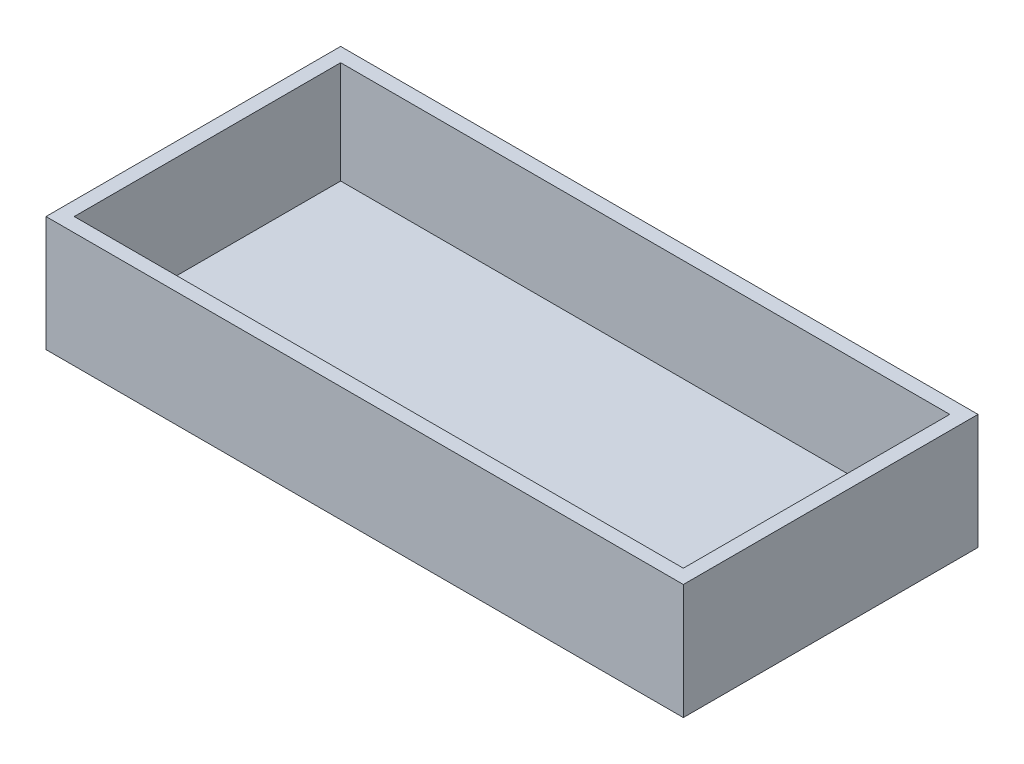
ISO-10303-21;
HEADER;
FILE_DESCRIPTION(('STEP AP214'),'2;1');
FILE_NAME('part.step','',(''),(''),'','','');
FILE_SCHEMA(('AUTOMOTIVE_DESIGN { 1 0 10303 214 1 1 1 1 }'));
ENDSEC;
DATA;
#1=APPLICATION_CONTEXT('core data for automotive mechanical design processes');
#2=APPLICATION_PROTOCOL_DEFINITION('international standard','automotive_design',2000,#1);
#3=PRODUCT_CONTEXT('',#1,'mechanical');
#4=PRODUCT('Part','Part','',(#3));
#5=PRODUCT_RELATED_PRODUCT_CATEGORY('part','',(#4));
#6=PRODUCT_DEFINITION_FORMATION('','',#4);
#7=PRODUCT_DEFINITION_CONTEXT('part definition',#1,'design');
#8=PRODUCT_DEFINITION('design','',#6,#7);
#9=PRODUCT_DEFINITION_SHAPE('','',#8);
#10=(LENGTH_UNIT() NAMED_UNIT(*) SI_UNIT(.MILLI.,.METRE.));
#11=(NAMED_UNIT(*) PLANE_ANGLE_UNIT() SI_UNIT($,.RADIAN.));
#12=(NAMED_UNIT(*) SI_UNIT($,.STERADIAN.) SOLID_ANGLE_UNIT());
#13=UNCERTAINTY_MEASURE_WITH_UNIT(LENGTH_MEASURE(1.E-05),#10,'distance_accuracy_value','');
#14=(GEOMETRIC_REPRESENTATION_CONTEXT(3) GLOBAL_UNCERTAINTY_ASSIGNED_CONTEXT((#13)) GLOBAL_UNIT_ASSIGNED_CONTEXT((#10,
#11,#12)) REPRESENTATION_CONTEXT('',''));
#15=CARTESIAN_POINT('',(0.,0.,0.));
#16=DIRECTION('',(0.,0.,1.));
#17=DIRECTION('',(1.,0.,0.));
#18=AXIS2_PLACEMENT_3D('',#15,#16,#17);
#19=CARTESIAN_POINT('',(0.,50.8,0.));
#20=DIRECTION('',(0.,-1.,0.));
#21=DIRECTION('',(0.,0.,-1.));
#22=AXIS2_PLACEMENT_3D('',#19,#20,#21);
#23=PLANE('',#22);
#24=DIRECTION('',(0.,0.,1.));
#25=VECTOR('',#24,1.);
#26=CARTESIAN_POINT('',(-157.99054,50.8,73.04024));
#27=LINE('',#26,#25);
#28=CARTESIAN_POINT('',(-157.99054,50.8,-73.04024));
#29=VERTEX_POINT('',#28);
#30=CARTESIAN_POINT('',(-157.99054,50.8,73.04024));
#31=VERTEX_POINT('',#30);
#32=EDGE_CURVE('E155',#29,#31,#27,.T.);
#33=ORIENTED_EDGE('',*,*,#32,.T.);
#34=DIRECTION('',(1.,0.,0.));
#35=VECTOR('',#34,1.);
#36=CARTESIAN_POINT('',(-157.99054,50.8,73.04024));
#37=LINE('',#36,#35);
#38=CARTESIAN_POINT('',(157.99054,50.8,73.04024));
#39=VERTEX_POINT('',#38);
#40=EDGE_CURVE('E109',#31,#39,#37,.T.);
#41=ORIENTED_EDGE('',*,*,#40,.T.);
#42=DIRECTION('',(0.,0.,-1.));
#43=VECTOR('',#42,1.);
#44=CARTESIAN_POINT('',(157.99054,50.8,73.04024));
#45=LINE('',#44,#43);
#46=CARTESIAN_POINT('',(157.99054,50.8,-73.04024));
#47=VERTEX_POINT('',#46);
#48=EDGE_CURVE('E158',#39,#47,#45,.T.);
#49=ORIENTED_EDGE('',*,*,#48,.T.);
#50=DIRECTION('',(-1.,0.,0.));
#51=VECTOR('',#50,1.);
#52=CARTESIAN_POINT('',(-157.99054,50.8,-73.04024));
#53=LINE('',#52,#51);
#54=EDGE_CURVE('E160',#47,#29,#53,.T.);
#55=ORIENTED_EDGE('',*,*,#54,.T.);
#56=EDGE_LOOP('',(#33,#41,#49,#55));
#57=FACE_BOUND('',#56,.T.);
#58=DIRECTION('',(0.,0.,-1.));
#59=VECTOR('',#58,1.);
#60=CARTESIAN_POINT('',(150.9903,50.8,66.04));
#61=LINE('',#60,#59);
#62=CARTESIAN_POINT('',(150.9903,50.8,66.04));
#63=VERTEX_POINT('',#62);
#64=CARTESIAN_POINT('',(150.9903,50.8,-66.04));
#65=VERTEX_POINT('',#64);
#66=EDGE_CURVE('E130',#63,#65,#61,.T.);
#67=ORIENTED_EDGE('',*,*,#66,.F.);
#68=DIRECTION('',(1.,0.,0.));
#69=VECTOR('',#68,1.);
#70=CARTESIAN_POINT('',(-150.9903,50.8,66.04));
#71=LINE('',#70,#69);
#72=CARTESIAN_POINT('',(-150.9903,50.8,66.04));
#73=VERTEX_POINT('',#72);
#74=EDGE_CURVE('E137',#73,#63,#71,.T.);
#75=ORIENTED_EDGE('',*,*,#74,.F.);
#76=DIRECTION('',(0.,0.,1.));
#77=VECTOR('',#76,1.);
#78=CARTESIAN_POINT('',(-150.9903,50.8,66.04));
#79=LINE('',#78,#77);
#80=CARTESIAN_POINT('',(-150.9903,50.8,-66.04));
#81=VERTEX_POINT('',#80);
#82=EDGE_CURVE('E135',#81,#73,#79,.T.);
#83=ORIENTED_EDGE('',*,*,#82,.F.);
#84=DIRECTION('',(-1.,0.,0.));
#85=VECTOR('',#84,1.);
#86=CARTESIAN_POINT('',(-150.9903,50.8,-66.04));
#87=LINE('',#86,#85);
#88=EDGE_CURVE('E132',#65,#81,#87,.T.);
#89=ORIENTED_EDGE('',*,*,#88,.F.);
#90=EDGE_LOOP('',(#67,#75,#83,#89));
#91=FACE_BOUND('',#90,.T.);
#92=ADVANCED_FACE('F38',(#57,#91),#23,.F.);
#93=CARTESIAN_POINT('',(-157.99054,50.8,73.04024));
#94=DIRECTION('',(1.,0.,0.));
#95=DIRECTION('',(0.,0.,-1.));
#96=AXIS2_PLACEMENT_3D('',#93,#94,#95);
#97=PLANE('',#96);
#98=DIRECTION('',(0.,-1.,0.));
#99=VECTOR('',#98,1.);
#100=CARTESIAN_POINT('',(-157.99054,50.8,-73.04024));
#101=LINE('',#100,#99);
#102=CARTESIAN_POINT('',(-157.99054,-6.35,-73.04024));
#103=VERTEX_POINT('',#102);
#104=EDGE_CURVE('E116',#29,#103,#101,.T.);
#105=ORIENTED_EDGE('',*,*,#104,.T.);
#106=DIRECTION('',(0.,0.,-1.));
#107=VECTOR('',#106,1.);
#108=CARTESIAN_POINT('',(-157.99054,-6.35,73.04024));
#109=LINE('',#108,#107);
#110=CARTESIAN_POINT('',(-157.99054,-6.35,73.04024));
#111=VERTEX_POINT('',#110);
#112=EDGE_CURVE('E114',#111,#103,#109,.T.);
#113=ORIENTED_EDGE('',*,*,#112,.F.);
#114=DIRECTION('',(0.,-1.,0.));
#115=VECTOR('',#114,1.);
#116=CARTESIAN_POINT('',(-157.99054,50.8,73.04024));
#117=LINE('',#116,#115);
#118=EDGE_CURVE('E11',#31,#111,#117,.T.);
#119=ORIENTED_EDGE('',*,*,#118,.F.);
#120=ORIENTED_EDGE('',*,*,#32,.F.);
#121=EDGE_LOOP('',(#105,#113,#119,#120));
#122=FACE_BOUND('',#121,.T.);
#123=ADVANCED_FACE('F40',(#122),#97,.F.);
#124=CARTESIAN_POINT('',(-157.99054,50.8,73.04024));
#125=DIRECTION('',(0.,0.,-1.));
#126=DIRECTION('',(-1.,0.,0.));
#127=AXIS2_PLACEMENT_3D('',#124,#125,#126);
#128=PLANE('',#127);
#129=ORIENTED_EDGE('',*,*,#118,.T.);
#130=DIRECTION('',(-1.,0.,0.));
#131=VECTOR('',#130,1.);
#132=CARTESIAN_POINT('',(157.99054,-6.35,73.04024));
#133=LINE('',#132,#131);
#134=CARTESIAN_POINT('',(157.99054,-6.35,73.04024));
#135=VERTEX_POINT('',#134);
#136=EDGE_CURVE('E108',#135,#111,#133,.T.);
#137=ORIENTED_EDGE('',*,*,#136,.F.);
#138=DIRECTION('',(0.,-1.,0.));
#139=VECTOR('',#138,1.);
#140=CARTESIAN_POINT('',(157.99054,50.8,73.04024));
#141=LINE('',#140,#139);
#142=EDGE_CURVE('E46',#39,#135,#141,.T.);
#143=ORIENTED_EDGE('',*,*,#142,.F.);
#144=ORIENTED_EDGE('',*,*,#40,.F.);
#145=EDGE_LOOP('',(#129,#137,#143,#144));
#146=FACE_BOUND('',#145,.T.);
#147=ADVANCED_FACE('F105',(#146),#128,.F.);
#148=CARTESIAN_POINT('',(157.99054,50.8,73.04024));
#149=DIRECTION('',(-1.,0.,0.));
#150=DIRECTION('',(0.,0.,1.));
#151=AXIS2_PLACEMENT_3D('',#148,#149,#150);
#152=PLANE('',#151);
#153=ORIENTED_EDGE('',*,*,#142,.T.);
#154=DIRECTION('',(0.,0.,1.));
#155=VECTOR('',#154,1.);
#156=CARTESIAN_POINT('',(157.99054,-6.35,-73.04024));
#157=LINE('',#156,#155);
#158=CARTESIAN_POINT('',(157.99054,-6.35,-73.04024));
#159=VERTEX_POINT('',#158);
#160=EDGE_CURVE('E125',#159,#135,#157,.T.);
#161=ORIENTED_EDGE('',*,*,#160,.F.);
#162=DIRECTION('',(0.,-1.,0.));
#163=VECTOR('',#162,1.);
#164=CARTESIAN_POINT('',(157.99054,50.8,-73.04024));
#165=LINE('',#164,#163);
#166=EDGE_CURVE('E163',#47,#159,#165,.T.);
#167=ORIENTED_EDGE('',*,*,#166,.F.);
#168=ORIENTED_EDGE('',*,*,#48,.F.);
#169=EDGE_LOOP('',(#153,#161,#167,#168));
#170=FACE_BOUND('',#169,.T.);
#171=ADVANCED_FACE('F166',(#170),#152,.F.);
#172=CARTESIAN_POINT('',(-157.99054,50.8,-73.04024));
#173=DIRECTION('',(0.,0.,1.));
#174=DIRECTION('',(1.,0.,0.));
#175=AXIS2_PLACEMENT_3D('',#172,#173,#174);
#176=PLANE('',#175);
#177=ORIENTED_EDGE('',*,*,#166,.T.);
#178=DIRECTION('',(1.,0.,0.));
#179=VECTOR('',#178,1.);
#180=CARTESIAN_POINT('',(-157.99054,-6.35,-73.04024));
#181=LINE('',#180,#179);
#182=EDGE_CURVE('E120',#103,#159,#181,.T.);
#183=ORIENTED_EDGE('',*,*,#182,.F.);
#184=ORIENTED_EDGE('',*,*,#104,.F.);
#185=ORIENTED_EDGE('',*,*,#54,.F.);
#186=EDGE_LOOP('',(#177,#183,#184,#185));
#187=FACE_BOUND('',#186,.T.);
#188=ADVANCED_FACE('F172',(#187),#176,.F.);
#189=CARTESIAN_POINT('',(150.9903,50.8,66.04));
#190=DIRECTION('',(-1.,0.,0.));
#191=DIRECTION('',(0.,0.,1.));
#192=AXIS2_PLACEMENT_3D('',#189,#190,#191);
#193=PLANE('',#192);
#194=DIRECTION('',(0.,0.,-1.));
#195=VECTOR('',#194,1.);
#196=CARTESIAN_POINT('',(150.9903,0.,66.04));
#197=LINE('',#196,#195);
#198=CARTESIAN_POINT('',(150.9903,0.,66.04));
#199=VERTEX_POINT('',#198);
#200=CARTESIAN_POINT('',(150.9903,0.,-66.04));
#201=VERTEX_POINT('',#200);
#202=EDGE_CURVE('E61',#199,#201,#197,.T.);
#203=ORIENTED_EDGE('',*,*,#202,.F.);
#204=DIRECTION('',(0.,-1.,0.));
#205=VECTOR('',#204,1.);
#206=CARTESIAN_POINT('',(150.9903,50.8,66.04));
#207=LINE('',#206,#205);
#208=EDGE_CURVE('E139',#63,#199,#207,.T.);
#209=ORIENTED_EDGE('',*,*,#208,.F.);
#210=ORIENTED_EDGE('',*,*,#66,.T.);
#211=DIRECTION('',(0.,-1.,0.));
#212=VECTOR('',#211,1.);
#213=CARTESIAN_POINT('',(150.9903,50.8,-66.04));
#214=LINE('',#213,#212);
#215=EDGE_CURVE('E153',#65,#201,#214,.T.);
#216=ORIENTED_EDGE('',*,*,#215,.T.);
#217=EDGE_LOOP('',(#203,#209,#210,#216));
#218=FACE_BOUND('',#217,.T.);
#219=ADVANCED_FACE('F174',(#218),#193,.T.);
#220=CARTESIAN_POINT('',(-150.9903,50.8,-66.04));
#221=DIRECTION('',(0.,0.,1.));
#222=DIRECTION('',(1.,0.,0.));
#223=AXIS2_PLACEMENT_3D('',#220,#221,#222);
#224=PLANE('',#223);
#225=DIRECTION('',(-1.,0.,0.));
#226=VECTOR('',#225,1.);
#227=CARTESIAN_POINT('',(-150.9903,0.,-66.04));
#228=LINE('',#227,#226);
#229=CARTESIAN_POINT('',(-150.9903,0.,-66.04));
#230=VERTEX_POINT('',#229);
#231=EDGE_CURVE('E141',#201,#230,#228,.T.);
#232=ORIENTED_EDGE('',*,*,#231,.F.);
#233=ORIENTED_EDGE('',*,*,#215,.F.);
#234=ORIENTED_EDGE('',*,*,#88,.T.);
#235=DIRECTION('',(0.,-1.,0.));
#236=VECTOR('',#235,1.);
#237=CARTESIAN_POINT('',(-150.9903,50.8,-66.04));
#238=LINE('',#237,#236);
#239=EDGE_CURVE('E151',#81,#230,#238,.T.);
#240=ORIENTED_EDGE('',*,*,#239,.T.);
#241=EDGE_LOOP('',(#232,#233,#234,#240));
#242=FACE_BOUND('',#241,.T.);
#243=ADVANCED_FACE('F180',(#242),#224,.T.);
#244=CARTESIAN_POINT('',(-150.9903,50.8,66.04));
#245=DIRECTION('',(1.,0.,0.));
#246=DIRECTION('',(0.,0.,-1.));
#247=AXIS2_PLACEMENT_3D('',#244,#245,#246);
#248=PLANE('',#247);
#249=DIRECTION('',(0.,0.,1.));
#250=VECTOR('',#249,1.);
#251=CARTESIAN_POINT('',(-150.9903,0.,66.04));
#252=LINE('',#251,#250);
#253=CARTESIAN_POINT('',(-150.9903,0.,66.04));
#254=VERTEX_POINT('',#253);
#255=EDGE_CURVE('E144',#230,#254,#252,.T.);
#256=ORIENTED_EDGE('',*,*,#255,.F.);
#257=ORIENTED_EDGE('',*,*,#239,.F.);
#258=ORIENTED_EDGE('',*,*,#82,.T.);
#259=DIRECTION('',(0.,-1.,0.));
#260=VECTOR('',#259,1.);
#261=CARTESIAN_POINT('',(-150.9903,50.8,66.04));
#262=LINE('',#261,#260);
#263=EDGE_CURVE('E53',#73,#254,#262,.T.);
#264=ORIENTED_EDGE('',*,*,#263,.T.);
#265=EDGE_LOOP('',(#256,#257,#258,#264));
#266=FACE_BOUND('',#265,.T.);
#267=ADVANCED_FACE('F191',(#266),#248,.T.);
#268=CARTESIAN_POINT('',(-150.9903,50.8,66.04));
#269=DIRECTION('',(0.,0.,-1.));
#270=DIRECTION('',(-1.,0.,0.));
#271=AXIS2_PLACEMENT_3D('',#268,#269,#270);
#272=PLANE('',#271);
#273=DIRECTION('',(1.,0.,0.));
#274=VECTOR('',#273,1.);
#275=CARTESIAN_POINT('',(-150.9903,0.,66.04));
#276=LINE('',#275,#274);
#277=EDGE_CURVE('E133',#254,#199,#276,.T.);
#278=ORIENTED_EDGE('',*,*,#277,.F.);
#279=ORIENTED_EDGE('',*,*,#263,.F.);
#280=ORIENTED_EDGE('',*,*,#74,.T.);
#281=ORIENTED_EDGE('',*,*,#208,.T.);
#282=EDGE_LOOP('',(#278,#279,#280,#281));
#283=FACE_BOUND('',#282,.T.);
#284=ADVANCED_FACE('F195',(#283),#272,.T.);
#285=CARTESIAN_POINT('',(0.,0.,0.));
#286=DIRECTION('',(0.,-1.,0.));
#287=DIRECTION('',(0.,0.,-1.));
#288=AXIS2_PLACEMENT_3D('',#285,#286,#287);
#289=PLANE('',#288);
#290=ORIENTED_EDGE('',*,*,#255,.T.);
#291=ORIENTED_EDGE('',*,*,#277,.T.);
#292=ORIENTED_EDGE('',*,*,#202,.T.);
#293=ORIENTED_EDGE('',*,*,#231,.T.);
#294=EDGE_LOOP('',(#290,#291,#292,#293));
#295=FACE_BOUND('',#294,.T.);
#296=ADVANCED_FACE('F199',(#295),#289,.F.);
#297=CARTESIAN_POINT('',(0.,-6.35,0.));
#298=DIRECTION('',(0.,-1.,0.));
#299=DIRECTION('',(0.,0.,-1.));
#300=AXIS2_PLACEMENT_3D('',#297,#298,#299);
#301=PLANE('',#300);
#302=ORIENTED_EDGE('',*,*,#136,.T.);
#303=ORIENTED_EDGE('',*,*,#112,.T.);
#304=ORIENTED_EDGE('',*,*,#182,.T.);
#305=ORIENTED_EDGE('',*,*,#160,.T.);
#306=EDGE_LOOP('',(#302,#303,#304,#305));
#307=FACE_BOUND('',#306,.T.);
#308=ADVANCED_FACE('F123',(#307),#301,.T.);
#309=CLOSED_SHELL('',(#92,#123,#147,#171,#188,#219,#243,#267,#284,#296,#308));
#310=MANIFOLD_SOLID_BREP('B2',#309);
#311=ADVANCED_BREP_SHAPE_REPRESENTATION('',(#18,#310),#14);
#312=SHAPE_DEFINITION_REPRESENTATION(#9,#311);
ENDSEC;
END-ISO-10303-21;
